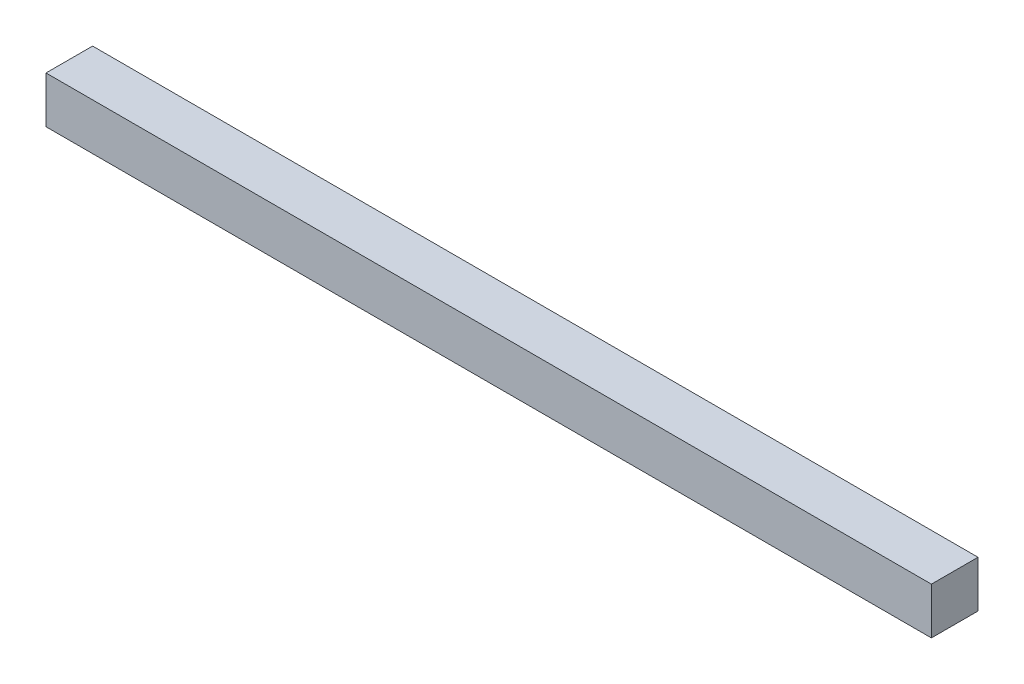
ISO-10303-21;
HEADER;
FILE_DESCRIPTION(('STEP AP214'),'2;1');
FILE_NAME('part.step','',(''),(''),'','','');
FILE_SCHEMA(('AUTOMOTIVE_DESIGN { 1 0 10303 214 1 1 1 1 }'));
ENDSEC;
DATA;
#1=APPLICATION_CONTEXT('core data for automotive mechanical design processes');
#2=APPLICATION_PROTOCOL_DEFINITION('international standard','automotive_design',2000,#1);
#3=PRODUCT_CONTEXT('',#1,'mechanical');
#4=PRODUCT('Part','Part','',(#3));
#5=PRODUCT_RELATED_PRODUCT_CATEGORY('part','',(#4));
#6=PRODUCT_DEFINITION_FORMATION('','',#4);
#7=PRODUCT_DEFINITION_CONTEXT('part definition',#1,'design');
#8=PRODUCT_DEFINITION('design','',#6,#7);
#9=PRODUCT_DEFINITION_SHAPE('','',#8);
#10=(LENGTH_UNIT() NAMED_UNIT(*) SI_UNIT(.MILLI.,.METRE.));
#11=(NAMED_UNIT(*) PLANE_ANGLE_UNIT() SI_UNIT($,.RADIAN.));
#12=(NAMED_UNIT(*) SI_UNIT($,.STERADIAN.) SOLID_ANGLE_UNIT());
#13=UNCERTAINTY_MEASURE_WITH_UNIT(LENGTH_MEASURE(1.E-05),#10,'distance_accuracy_value','');
#14=(GEOMETRIC_REPRESENTATION_CONTEXT(3) GLOBAL_UNCERTAINTY_ASSIGNED_CONTEXT((#13)) GLOBAL_UNIT_ASSIGNED_CONTEXT((#10,
#11,#12)) REPRESENTATION_CONTEXT('',''));
#15=CARTESIAN_POINT('',(0.,0.,0.));
#16=DIRECTION('',(0.,0.,1.));
#17=DIRECTION('',(1.,0.,0.));
#18=AXIS2_PLACEMENT_3D('',#15,#16,#17);
#19=CARTESIAN_POINT('',(-53.9405868037197,12.7,-28.9440161104718));
#20=DIRECTION('',(1.,0.,0.));
#21=DIRECTION('',(0.,0.,-1.));
#22=AXIS2_PLACEMENT_3D('',#19,#20,#21);
#23=PLANE('',#22);
#24=DIRECTION('',(0.,0.,1.));
#25=VECTOR('',#24,1.);
#26=CARTESIAN_POINT('',(-53.9405868037197,0.,-28.9440161104718));
#27=LINE('',#26,#25);
#28=CARTESIAN_POINT('',(-53.9405868037197,0.,-28.9440161104718));
#29=VERTEX_POINT('',#28);
#30=CARTESIAN_POINT('',(-53.9405868037197,0.,-16.2440161104718));
#31=VERTEX_POINT('',#30);
#32=EDGE_CURVE('E107',#29,#31,#27,.T.);
#33=ORIENTED_EDGE('',*,*,#32,.T.);
#34=DIRECTION('',(0.,-1.,0.));
#35=VECTOR('',#34,1.);
#36=CARTESIAN_POINT('',(-53.9405868037197,12.7,-16.2440161104718));
#37=LINE('',#36,#35);
#38=CARTESIAN_POINT('',(-53.9405868037197,12.7,-16.2440161104718));
#39=VERTEX_POINT('',#38);
#40=EDGE_CURVE('E11',#39,#31,#37,.T.);
#41=ORIENTED_EDGE('',*,*,#40,.F.);
#42=DIRECTION('',(0.,0.,1.));
#43=VECTOR('',#42,1.);
#44=CARTESIAN_POINT('',(-53.9405868037197,12.7,-28.9440161104718));
#45=LINE('',#44,#43);
#46=CARTESIAN_POINT('',(-53.9405868037197,12.7,-28.9440161104718));
#47=VERTEX_POINT('',#46);
#48=EDGE_CURVE('E91',#47,#39,#45,.T.);
#49=ORIENTED_EDGE('',*,*,#48,.F.);
#50=DIRECTION('',(0.,-1.,0.));
#51=VECTOR('',#50,1.);
#52=CARTESIAN_POINT('',(-53.9405868037197,12.7,-28.9440161104718));
#53=LINE('',#52,#51);
#54=EDGE_CURVE('E103',#47,#29,#53,.T.);
#55=ORIENTED_EDGE('',*,*,#54,.T.);
#56=EDGE_LOOP('',(#33,#41,#49,#55));
#57=FACE_BOUND('',#56,.T.);
#58=ADVANCED_FACE('F39',(#57),#23,.F.);
#59=CARTESIAN_POINT('',(-53.9405868037197,12.7,-16.2440161104718));
#60=DIRECTION('',(0.,0.,-1.));
#61=DIRECTION('',(-1.,0.,0.));
#62=AXIS2_PLACEMENT_3D('',#59,#60,#61);
#63=PLANE('',#62);
#64=DIRECTION('',(1.,0.,0.));
#65=VECTOR('',#64,1.);
#66=CARTESIAN_POINT('',(-53.9405868037197,0.,-16.2440161104718));
#67=LINE('',#66,#65);
#68=CARTESIAN_POINT('',(187.35941319628,0.,-16.2440161104718));
#69=VERTEX_POINT('',#68);
#70=EDGE_CURVE('E96',#31,#69,#67,.T.);
#71=ORIENTED_EDGE('',*,*,#70,.T.);
#72=DIRECTION('',(0.,-1.,0.));
#73=VECTOR('',#72,1.);
#74=CARTESIAN_POINT('',(187.35941319628,12.7,-16.2440161104718));
#75=LINE('',#74,#73);
#76=CARTESIAN_POINT('',(187.35941319628,12.7,-16.2440161104718));
#77=VERTEX_POINT('',#76);
#78=EDGE_CURVE('E48',#77,#69,#75,.T.);
#79=ORIENTED_EDGE('',*,*,#78,.F.);
#80=DIRECTION('',(1.,0.,0.));
#81=VECTOR('',#80,1.);
#82=CARTESIAN_POINT('',(-53.9405868037197,12.7,-16.2440161104718));
#83=LINE('',#82,#81);
#84=EDGE_CURVE('E86',#39,#77,#83,.T.);
#85=ORIENTED_EDGE('',*,*,#84,.F.);
#86=ORIENTED_EDGE('',*,*,#40,.T.);
#87=EDGE_LOOP('',(#71,#79,#85,#86));
#88=FACE_BOUND('',#87,.T.);
#89=ADVANCED_FACE('F95',(#88),#63,.F.);
#90=CARTESIAN_POINT('',(187.35941319628,12.7,-28.9440161104718));
#91=DIRECTION('',(-1.,0.,0.));
#92=DIRECTION('',(0.,0.,1.));
#93=AXIS2_PLACEMENT_3D('',#90,#91,#92);
#94=PLANE('',#93);
#95=DIRECTION('',(0.,0.,-1.));
#96=VECTOR('',#95,1.);
#97=CARTESIAN_POINT('',(187.35941319628,0.,-28.9440161104718));
#98=LINE('',#97,#96);
#99=CARTESIAN_POINT('',(187.35941319628,0.,-28.9440161104718));
#100=VERTEX_POINT('',#99);
#101=EDGE_CURVE('E73',#69,#100,#98,.T.);
#102=ORIENTED_EDGE('',*,*,#101,.T.);
#103=DIRECTION('',(0.,-1.,0.));
#104=VECTOR('',#103,1.);
#105=CARTESIAN_POINT('',(187.35941319628,12.7,-28.9440161104718));
#106=LINE('',#105,#104);
#107=CARTESIAN_POINT('',(187.35941319628,12.7,-28.9440161104718));
#108=VERTEX_POINT('',#107);
#109=EDGE_CURVE('E98',#108,#100,#106,.T.);
#110=ORIENTED_EDGE('',*,*,#109,.F.);
#111=DIRECTION('',(0.,0.,-1.));
#112=VECTOR('',#111,1.);
#113=CARTESIAN_POINT('',(187.35941319628,12.7,-28.9440161104718));
#114=LINE('',#113,#112);
#115=EDGE_CURVE('E89',#77,#108,#114,.T.);
#116=ORIENTED_EDGE('',*,*,#115,.F.);
#117=ORIENTED_EDGE('',*,*,#78,.T.);
#118=EDGE_LOOP('',(#102,#110,#116,#117));
#119=FACE_BOUND('',#118,.T.);
#120=ADVANCED_FACE('F99',(#119),#94,.F.);
#121=CARTESIAN_POINT('',(-53.9405868037197,12.7,-28.9440161104718));
#122=DIRECTION('',(0.,0.,1.));
#123=DIRECTION('',(1.,0.,0.));
#124=AXIS2_PLACEMENT_3D('',#121,#122,#123);
#125=PLANE('',#124);
#126=DIRECTION('',(-1.,0.,0.));
#127=VECTOR('',#126,1.);
#128=CARTESIAN_POINT('',(-53.9405868037197,0.,-28.9440161104718));
#129=LINE('',#128,#127);
#130=EDGE_CURVE('E79',#100,#29,#129,.T.);
#131=ORIENTED_EDGE('',*,*,#130,.T.);
#132=ORIENTED_EDGE('',*,*,#54,.F.);
#133=DIRECTION('',(-1.,0.,0.));
#134=VECTOR('',#133,1.);
#135=CARTESIAN_POINT('',(-53.9405868037197,12.7,-28.9440161104718));
#136=LINE('',#135,#134);
#137=EDGE_CURVE('E56',#108,#47,#136,.T.);
#138=ORIENTED_EDGE('',*,*,#137,.F.);
#139=ORIENTED_EDGE('',*,*,#109,.T.);
#140=EDGE_LOOP('',(#131,#132,#138,#139));
#141=FACE_BOUND('',#140,.T.);
#142=ADVANCED_FACE('F120',(#141),#125,.F.);
#143=CARTESIAN_POINT('',(0.,12.7,0.));
#144=DIRECTION('',(0.,1.,0.));
#145=DIRECTION('',(0.,0.,1.));
#146=AXIS2_PLACEMENT_3D('',#143,#144,#145);
#147=PLANE('',#146);
#148=ORIENTED_EDGE('',*,*,#48,.T.);
#149=ORIENTED_EDGE('',*,*,#84,.T.);
#150=ORIENTED_EDGE('',*,*,#115,.T.);
#151=ORIENTED_EDGE('',*,*,#137,.T.);
#152=EDGE_LOOP('',(#148,#149,#150,#151));
#153=FACE_BOUND('',#152,.T.);
#154=ADVANCED_FACE('F87',(#153),#147,.T.);
#155=CARTESIAN_POINT('',(0.,0.,0.));
#156=DIRECTION('',(0.,1.,0.));
#157=DIRECTION('',(0.,0.,1.));
#158=AXIS2_PLACEMENT_3D('',#155,#156,#157);
#159=PLANE('',#158);
#160=ORIENTED_EDGE('',*,*,#32,.F.);
#161=ORIENTED_EDGE('',*,*,#130,.F.);
#162=ORIENTED_EDGE('',*,*,#101,.F.);
#163=ORIENTED_EDGE('',*,*,#70,.F.);
#164=EDGE_LOOP('',(#160,#161,#162,#163));
#165=FACE_BOUND('',#164,.T.);
#166=ADVANCED_FACE('F123',(#165),#159,.F.);
#167=CLOSED_SHELL('',(#58,#89,#120,#142,#154,#166));
#168=MANIFOLD_SOLID_BREP('B2',#167);
#169=ADVANCED_BREP_SHAPE_REPRESENTATION('',(#18,#168),#14);
#170=SHAPE_DEFINITION_REPRESENTATION(#9,#169);
ENDSEC;
END-ISO-10303-21;
